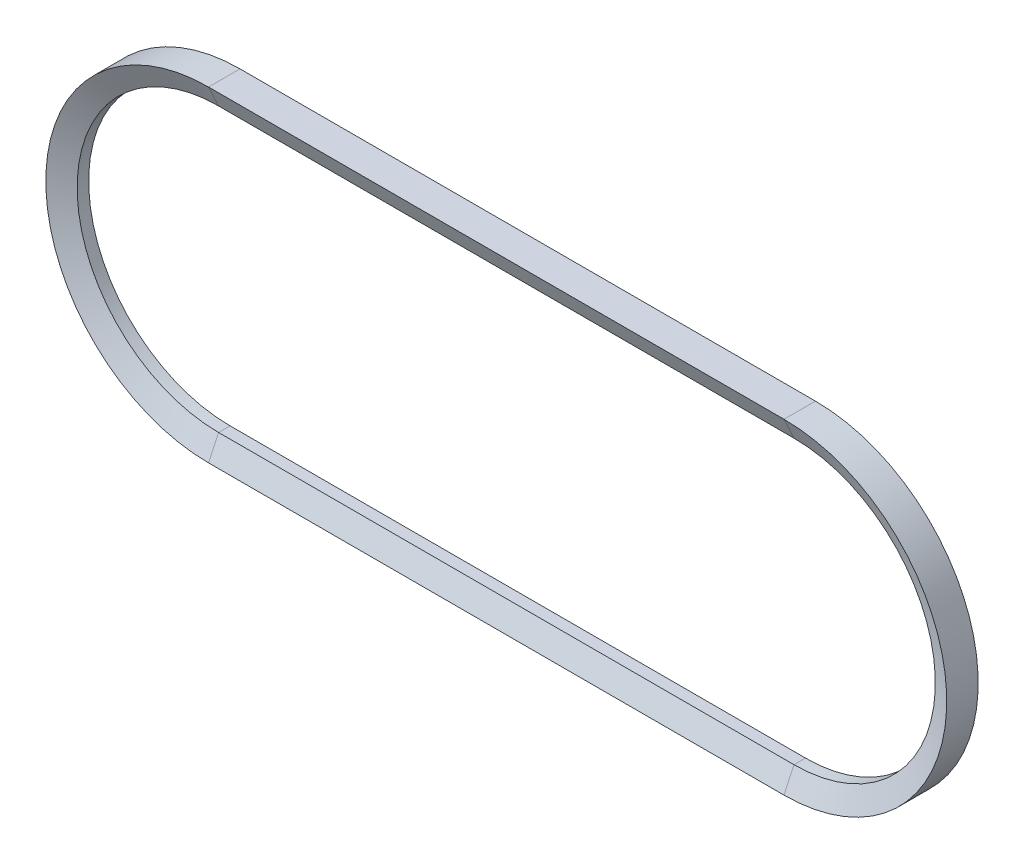
ISO-10303-21;
HEADER;
FILE_DESCRIPTION(('STEP AP214'),'2;1');
FILE_NAME('part.step','',(''),(''),'','','');
FILE_SCHEMA(('AUTOMOTIVE_DESIGN { 1 0 10303 214 1 1 1 1 }'));
ENDSEC;
DATA;
#1=APPLICATION_CONTEXT('core data for automotive mechanical design processes');
#2=APPLICATION_PROTOCOL_DEFINITION('international standard','automotive_design',2000,#1);
#3=PRODUCT_CONTEXT('',#1,'mechanical');
#4=PRODUCT('Part','Part','',(#3));
#5=PRODUCT_RELATED_PRODUCT_CATEGORY('part','',(#4));
#6=PRODUCT_DEFINITION_FORMATION('','',#4);
#7=PRODUCT_DEFINITION_CONTEXT('part definition',#1,'design');
#8=PRODUCT_DEFINITION('design','',#6,#7);
#9=PRODUCT_DEFINITION_SHAPE('','',#8);
#10=(LENGTH_UNIT() NAMED_UNIT(*) SI_UNIT(.MILLI.,.METRE.));
#11=(NAMED_UNIT(*) PLANE_ANGLE_UNIT() SI_UNIT($,.RADIAN.));
#12=(NAMED_UNIT(*) SI_UNIT($,.STERADIAN.) SOLID_ANGLE_UNIT());
#13=UNCERTAINTY_MEASURE_WITH_UNIT(LENGTH_MEASURE(1.E-05),#10,'distance_accuracy_value','');
#14=(GEOMETRIC_REPRESENTATION_CONTEXT(3) GLOBAL_UNCERTAINTY_ASSIGNED_CONTEXT((#13)) GLOBAL_UNIT_ASSIGNED_CONTEXT((#10,
#11,#12)) REPRESENTATION_CONTEXT('',''));
#15=CARTESIAN_POINT('',(0.,0.,0.));
#16=DIRECTION('',(0.,0.,1.));
#17=DIRECTION('',(1.,0.,0.));
#18=AXIS2_PLACEMENT_3D('',#15,#16,#17);
#19=CARTESIAN_POINT('',(700.000000000001,172.000000000001,-7.00000000000001));
#20=DIRECTION('',(0.,0.4226182617407,0.90630778703665));
#21=DIRECTION('',(0.,-0.90630778703665,0.4226182617407));
#22=AXIS2_PLACEMENT_3D('',#19,#20,#21);
#23=PLANE('',#22);
#24=DIRECTION('',(0.,0.90630778703665,-0.4226182617407));
#25=VECTOR('',#24,1.);
#26=CARTESIAN_POINT('',(700.000000000001,172.000000000001,-7.00000000000001));
#27=LINE('',#26,#25);
#28=CARTESIAN_POINT('',(700.000000000001,172.000000000001,-7.00000000000001));
#29=VERTEX_POINT('',#28);
#30=CARTESIAN_POINT('',(700.000000000001,198.000000000001,-19.12399911203));
#31=VERTEX_POINT('',#30);
#32=EDGE_CURVE('E153',#29,#31,#27,.T.);
#33=ORIENTED_EDGE('',*,*,#32,.F.);
#34=DIRECTION('',(-1.,0.,0.));
#35=VECTOR('',#34,1.);
#36=CARTESIAN_POINT('',(700.000000000001,172.000000000001,-7.00000000000001));
#37=LINE('',#36,#35);
#38=CARTESIAN_POINT('',(0.,172.,-7.00000000000001));
#39=VERTEX_POINT('',#38);
#40=EDGE_CURVE('E152',#29,#39,#37,.T.);
#41=ORIENTED_EDGE('',*,*,#40,.T.);
#42=DIRECTION('',(0.,0.90630778703665,-0.4226182617407));
#43=VECTOR('',#42,1.);
#44=CARTESIAN_POINT('',(0.,172.,-7.00000000000001));
#45=LINE('',#44,#43);
#46=CARTESIAN_POINT('',(0.,198.,-19.12399911203));
#47=VERTEX_POINT('',#46);
#48=EDGE_CURVE('E131',#39,#47,#45,.T.);
#49=ORIENTED_EDGE('',*,*,#48,.T.);
#50=DIRECTION('',(-1.,0.,0.));
#51=VECTOR('',#50,1.);
#52=CARTESIAN_POINT('',(700.000000000001,198.000000000001,-19.12399911203));
#53=LINE('',#52,#51);
#54=EDGE_CURVE('E157',#31,#47,#53,.T.);
#55=ORIENTED_EDGE('',*,*,#54,.F.);
#56=EDGE_LOOP('',(#33,#41,#49,#55));
#57=FACE_BOUND('',#56,.T.);
#58=ADVANCED_FACE('F37',(#57),#23,.F.);
#59=CARTESIAN_POINT('',(1.09447445373907E-13,0.,-7.00000000000001));
#60=DIRECTION('',(0.,0.,-1.));
#61=DIRECTION('',(-1.,0.,0.));
#62=AXIS2_PLACEMENT_3D('',#59,#60,#61);
#63=CONICAL_SURFACE('',#62,172.,1.13446401379631);
#64=CARTESIAN_POINT('',(1.09447445373907E-13,0.,-19.12399911203));
#65=DIRECTION('',(0.,0.,1.));
#66=DIRECTION('',(0.,1.,0.));
#67=AXIS2_PLACEMENT_3D('',#64,#65,#66);
#68=CIRCLE('',#67,198.);
#69=CARTESIAN_POINT('',(0.,-198.,-19.12399911203));
#70=VERTEX_POINT('',#69);
#71=EDGE_CURVE('E121',#47,#70,#68,.T.);
#72=ORIENTED_EDGE('',*,*,#71,.F.);
#73=ORIENTED_EDGE('',*,*,#48,.F.);
#74=CARTESIAN_POINT('',(1.09447445373907E-13,0.,-7.00000000000001));
#75=DIRECTION('',(0.,0.,1.));
#76=DIRECTION('',(0.,1.,0.));
#77=AXIS2_PLACEMENT_3D('',#74,#75,#76);
#78=CIRCLE('',#77,172.);
#79=CARTESIAN_POINT('',(0.,-172.,-7.00000000000001));
#80=VERTEX_POINT('',#79);
#81=EDGE_CURVE('E134',#39,#80,#78,.T.);
#82=ORIENTED_EDGE('',*,*,#81,.T.);
#83=DIRECTION('',(0.,-0.90630778703665,-0.4226182617407));
#84=VECTOR('',#83,1.);
#85=CARTESIAN_POINT('',(0.,-172.,-7.00000000000001));
#86=LINE('',#85,#84);
#87=EDGE_CURVE('E149',#80,#70,#86,.T.);
#88=ORIENTED_EDGE('',*,*,#87,.T.);
#89=EDGE_LOOP('',(#72,#73,#82,#88));
#90=FACE_BOUND('',#89,.T.);
#91=ADVANCED_FACE('F133',(#90),#63,.F.);
#92=CARTESIAN_POINT('',(1.09447445373907E-13,0.,0.));
#93=DIRECTION('',(0.,0.,1.));
#94=DIRECTION('',(1.,0.,0.));
#95=AXIS2_PLACEMENT_3D('',#92,#93,#94);
#96=CYLINDRICAL_SURFACE('',#95,198.);
#97=CARTESIAN_POINT('',(1.09447445373907E-13,0.,19.12399911203));
#98=DIRECTION('',(0.,0.,1.));
#99=DIRECTION('',(0.,1.,0.));
#100=AXIS2_PLACEMENT_3D('',#97,#98,#99);
#101=CIRCLE('',#100,198.);
#102=CARTESIAN_POINT('',(0.,198.,19.12399911203));
#103=VERTEX_POINT('',#102);
#104=CARTESIAN_POINT('',(0.,-198.,19.12399911203));
#105=VERTEX_POINT('',#104);
#106=EDGE_CURVE('E115',#103,#105,#101,.T.);
#107=ORIENTED_EDGE('',*,*,#106,.F.);
#108=DIRECTION('',(0.,0.,1.));
#109=VECTOR('',#108,1.);
#110=CARTESIAN_POINT('',(0.,198.,19.12399911203));
#111=LINE('',#110,#109);
#112=EDGE_CURVE('E139',#47,#103,#111,.T.);
#113=ORIENTED_EDGE('',*,*,#112,.F.);
#114=ORIENTED_EDGE('',*,*,#71,.T.);
#115=DIRECTION('',(0.,0.,1.));
#116=VECTOR('',#115,1.);
#117=CARTESIAN_POINT('',(0.,-198.,19.12399911203));
#118=LINE('',#117,#116);
#119=EDGE_CURVE('E197',#70,#105,#118,.T.);
#120=ORIENTED_EDGE('',*,*,#119,.T.);
#121=EDGE_LOOP('',(#107,#113,#114,#120));
#122=FACE_BOUND('',#121,.T.);
#123=ADVANCED_FACE('F216',(#122),#96,.T.);
#124=CARTESIAN_POINT('',(1.09447445373907E-13,0.,19.12399911203));
#125=DIRECTION('',(0.,0.,1.));
#126=DIRECTION('',(1.,0.,0.));
#127=AXIS2_PLACEMENT_3D('',#124,#125,#126);
#128=CONICAL_SURFACE('',#127,198.,1.13446401379631);
#129=CARTESIAN_POINT('',(1.09447445373907E-13,0.,7.00000000000001));
#130=DIRECTION('',(0.,0.,1.));
#131=DIRECTION('',(0.,1.,0.));
#132=AXIS2_PLACEMENT_3D('',#129,#130,#131);
#133=CIRCLE('',#132,172.);
#134=CARTESIAN_POINT('',(0.,172.,7.00000000000001));
#135=VERTEX_POINT('',#134);
#136=CARTESIAN_POINT('',(0.,-172.,7.00000000000001));
#137=VERTEX_POINT('',#136);
#138=EDGE_CURVE('E167',#135,#137,#133,.T.);
#139=ORIENTED_EDGE('',*,*,#138,.F.);
#140=DIRECTION('',(0.,-0.90630778703665,-0.4226182617407));
#141=VECTOR('',#140,1.);
#142=CARTESIAN_POINT('',(0.,172.,7.00000000000001));
#143=LINE('',#142,#141);
#144=EDGE_CURVE('E160',#103,#135,#143,.T.);
#145=ORIENTED_EDGE('',*,*,#144,.F.);
#146=ORIENTED_EDGE('',*,*,#106,.T.);
#147=DIRECTION('',(0.,0.90630778703665,-0.4226182617407));
#148=VECTOR('',#147,1.);
#149=CARTESIAN_POINT('',(0.,-172.,7.00000000000001));
#150=LINE('',#149,#148);
#151=EDGE_CURVE('E185',#105,#137,#150,.T.);
#152=ORIENTED_EDGE('',*,*,#151,.T.);
#153=EDGE_LOOP('',(#139,#145,#146,#152));
#154=FACE_BOUND('',#153,.T.);
#155=ADVANCED_FACE('F184',(#154),#128,.F.);
#156=CARTESIAN_POINT('',(1.09447445373907E-13,0.,0.));
#157=DIRECTION('',(0.,0.,1.));
#158=DIRECTION('',(1.,0.,0.));
#159=AXIS2_PLACEMENT_3D('',#156,#157,#158);
#160=CYLINDRICAL_SURFACE('',#159,172.);
#161=DIRECTION('',(0.,0.,-1.));
#162=VECTOR('',#161,1.);
#163=CARTESIAN_POINT('',(0.,-172.,7.00000000000001));
#164=LINE('',#163,#162);
#165=EDGE_CURVE('E147',#137,#80,#164,.T.);
#166=ORIENTED_EDGE('',*,*,#165,.T.);
#167=ORIENTED_EDGE('',*,*,#81,.F.);
#168=DIRECTION('',(0.,0.,-1.));
#169=VECTOR('',#168,1.);
#170=CARTESIAN_POINT('',(0.,172.,7.00000000000001));
#171=LINE('',#170,#169);
#172=EDGE_CURVE('E146',#135,#39,#171,.T.);
#173=ORIENTED_EDGE('',*,*,#172,.F.);
#174=ORIENTED_EDGE('',*,*,#138,.T.);
#175=EDGE_LOOP('',(#166,#167,#173,#174));
#176=FACE_BOUND('',#175,.T.);
#177=ADVANCED_FACE('F144',(#176),#160,.F.);
#178=CARTESIAN_POINT('',(0.,-172.,-7.00000000000001));
#179=DIRECTION('',(0.,-0.4226182617407,0.90630778703665));
#180=DIRECTION('',(0.,-0.90630778703665,-0.4226182617407));
#181=AXIS2_PLACEMENT_3D('',#178,#179,#180);
#182=PLANE('',#181);
#183=DIRECTION('',(1.,0.,0.));
#184=VECTOR('',#183,1.);
#185=CARTESIAN_POINT('',(0.,-198.,-19.12399911203));
#186=LINE('',#185,#184);
#187=CARTESIAN_POINT('',(700.000000000002,-197.999999999999,-19.12399911203));
#188=VERTEX_POINT('',#187);
#189=EDGE_CURVE('E102',#70,#188,#186,.T.);
#190=ORIENTED_EDGE('',*,*,#189,.F.);
#191=ORIENTED_EDGE('',*,*,#87,.F.);
#192=DIRECTION('',(1.,0.,0.));
#193=VECTOR('',#192,1.);
#194=CARTESIAN_POINT('',(0.,-172.,-7.00000000000001));
#195=LINE('',#194,#193);
#196=CARTESIAN_POINT('',(700.000000000002,-171.999999999999,-7.00000000000001));
#197=VERTEX_POINT('',#196);
#198=EDGE_CURVE('E166',#80,#197,#195,.T.);
#199=ORIENTED_EDGE('',*,*,#198,.T.);
#200=DIRECTION('',(0.,-0.90630778703665,-0.4226182617407));
#201=VECTOR('',#200,1.);
#202=CARTESIAN_POINT('',(700.000000000002,-171.999999999999,-7.00000000000001));
#203=LINE('',#202,#201);
#204=EDGE_CURVE('E207',#197,#188,#203,.T.);
#205=ORIENTED_EDGE('',*,*,#204,.T.);
#206=EDGE_LOOP('',(#190,#191,#199,#205));
#207=FACE_BOUND('',#206,.T.);
#208=ADVANCED_FACE('F212',(#207),#182,.F.);
#209=CARTESIAN_POINT('',(0.,-198.,19.12399911203));
#210=DIRECTION('',(0.,1.,0.));
#211=DIRECTION('',(-1.,0.,0.));
#212=AXIS2_PLACEMENT_3D('',#209,#210,#211);
#213=PLANE('',#212);
#214=DIRECTION('',(1.,0.,0.));
#215=VECTOR('',#214,1.);
#216=CARTESIAN_POINT('',(0.,-198.,19.12399911203));
#217=LINE('',#216,#215);
#218=CARTESIAN_POINT('',(700.000000000002,-197.999999999999,19.12399911203));
#219=VERTEX_POINT('',#218);
#220=EDGE_CURVE('E95',#105,#219,#217,.T.);
#221=ORIENTED_EDGE('',*,*,#220,.F.);
#222=ORIENTED_EDGE('',*,*,#119,.F.);
#223=ORIENTED_EDGE('',*,*,#189,.T.);
#224=DIRECTION('',(0.,0.,1.));
#225=VECTOR('',#224,1.);
#226=CARTESIAN_POINT('',(700.000000000002,-197.999999999999,19.12399911203));
#227=LINE('',#226,#225);
#228=EDGE_CURVE('E194',#188,#219,#227,.T.);
#229=ORIENTED_EDGE('',*,*,#228,.T.);
#230=EDGE_LOOP('',(#221,#222,#223,#229));
#231=FACE_BOUND('',#230,.T.);
#232=ADVANCED_FACE('F215',(#231),#213,.F.);
#233=CARTESIAN_POINT('',(0.,-172.,7.00000000000001));
#234=DIRECTION('',(0.,-0.4226182617407,-0.90630778703665));
#235=DIRECTION('',(0.,0.90630778703665,-0.4226182617407));
#236=AXIS2_PLACEMENT_3D('',#233,#234,#235);
#237=PLANE('',#236);
#238=DIRECTION('',(1.,0.,0.));
#239=VECTOR('',#238,1.);
#240=CARTESIAN_POINT('',(0.,-172.,7.00000000000001));
#241=LINE('',#240,#239);
#242=CARTESIAN_POINT('',(700.000000000002,-171.999999999999,7.00000000000001));
#243=VERTEX_POINT('',#242);
#244=EDGE_CURVE('E86',#137,#243,#241,.T.);
#245=ORIENTED_EDGE('',*,*,#244,.F.);
#246=ORIENTED_EDGE('',*,*,#151,.F.);
#247=ORIENTED_EDGE('',*,*,#220,.T.);
#248=DIRECTION('',(0.,0.90630778703665,-0.4226182617407));
#249=VECTOR('',#248,1.);
#250=CARTESIAN_POINT('',(700.000000000002,-171.999999999999,7.00000000000001));
#251=LINE('',#250,#249);
#252=EDGE_CURVE('E172',#219,#243,#251,.T.);
#253=ORIENTED_EDGE('',*,*,#252,.T.);
#254=EDGE_LOOP('',(#245,#246,#247,#253));
#255=FACE_BOUND('',#254,.T.);
#256=ADVANCED_FACE('F234',(#255),#237,.F.);
#257=CARTESIAN_POINT('',(0.,-172.,7.00000000000001));
#258=DIRECTION('',(0.,-1.,0.));
#259=DIRECTION('',(1.,0.,0.));
#260=AXIS2_PLACEMENT_3D('',#257,#258,#259);
#261=PLANE('',#260);
#262=DIRECTION('',(0.,0.,-1.));
#263=VECTOR('',#262,1.);
#264=CARTESIAN_POINT('',(700.000000000002,-171.999999999999,7.00000000000001));
#265=LINE('',#264,#263);
#266=EDGE_CURVE('E168',#243,#197,#265,.T.);
#267=ORIENTED_EDGE('',*,*,#266,.T.);
#268=ORIENTED_EDGE('',*,*,#198,.F.);
#269=ORIENTED_EDGE('',*,*,#165,.F.);
#270=ORIENTED_EDGE('',*,*,#244,.T.);
#271=EDGE_LOOP('',(#267,#268,#269,#270));
#272=FACE_BOUND('',#271,.T.);
#273=ADVANCED_FACE('F226',(#272),#261,.F.);
#274=CARTESIAN_POINT('',(700.000000000002,1.19781344355109E-12,-7.00000000000001));
#275=DIRECTION('',(0.,0.,-1.));
#276=DIRECTION('',(-1.,0.,0.));
#277=AXIS2_PLACEMENT_3D('',#274,#275,#276);
#278=CONICAL_SURFACE('',#277,172.,1.13446401379631);
#279=CARTESIAN_POINT('',(700.000000000002,1.19781344355109E-12,-19.12399911203));
#280=DIRECTION('',(0.,0.,1.));
#281=DIRECTION('',(0.,-1.,0.));
#282=AXIS2_PLACEMENT_3D('',#279,#280,#281);
#283=CIRCLE('',#282,198.);
#284=EDGE_CURVE('E192',#188,#31,#283,.T.);
#285=ORIENTED_EDGE('',*,*,#284,.F.);
#286=ORIENTED_EDGE('',*,*,#204,.F.);
#287=CARTESIAN_POINT('',(700.000000000002,1.19781344355109E-12,-7.00000000000001));
#288=DIRECTION('',(0.,0.,1.));
#289=DIRECTION('',(0.,-1.,0.));
#290=AXIS2_PLACEMENT_3D('',#287,#288,#289);
#291=CIRCLE('',#290,172.);
#292=EDGE_CURVE('E169',#197,#29,#291,.T.);
#293=ORIENTED_EDGE('',*,*,#292,.T.);
#294=ORIENTED_EDGE('',*,*,#32,.T.);
#295=EDGE_LOOP('',(#285,#286,#293,#294));
#296=FACE_BOUND('',#295,.T.);
#297=ADVANCED_FACE('F224',(#296),#278,.F.);
#298=CARTESIAN_POINT('',(700.000000000002,1.19781344355109E-12,0.));
#299=DIRECTION('',(0.,0.,1.));
#300=DIRECTION('',(1.,0.,0.));
#301=AXIS2_PLACEMENT_3D('',#298,#299,#300);
#302=CYLINDRICAL_SURFACE('',#301,198.);
#303=CARTESIAN_POINT('',(700.000000000002,1.19781344355109E-12,19.12399911203));
#304=DIRECTION('',(0.,0.,1.));
#305=DIRECTION('',(0.,-1.,0.));
#306=AXIS2_PLACEMENT_3D('',#303,#304,#305);
#307=CIRCLE('',#306,198.);
#308=CARTESIAN_POINT('',(700.000000000001,198.000000000001,19.12399911203));
#309=VERTEX_POINT('',#308);
#310=EDGE_CURVE('E62',#219,#309,#307,.T.);
#311=ORIENTED_EDGE('',*,*,#310,.F.);
#312=ORIENTED_EDGE('',*,*,#228,.F.);
#313=ORIENTED_EDGE('',*,*,#284,.T.);
#314=DIRECTION('',(0.,0.,1.));
#315=VECTOR('',#314,1.);
#316=CARTESIAN_POINT('',(700.000000000001,198.000000000001,19.12399911203));
#317=LINE('',#316,#315);
#318=EDGE_CURVE('E190',#31,#309,#317,.T.);
#319=ORIENTED_EDGE('',*,*,#318,.T.);
#320=EDGE_LOOP('',(#311,#312,#313,#319));
#321=FACE_BOUND('',#320,.T.);
#322=ADVANCED_FACE('F221',(#321),#302,.T.);
#323=CARTESIAN_POINT('',(700.000000000002,1.19781344355109E-12,19.12399911203));
#324=DIRECTION('',(0.,0.,1.));
#325=DIRECTION('',(1.,0.,0.));
#326=AXIS2_PLACEMENT_3D('',#323,#324,#325);
#327=CONICAL_SURFACE('',#326,198.,1.13446401379631);
#328=CARTESIAN_POINT('',(700.000000000002,1.19781344355109E-12,7.00000000000001));
#329=DIRECTION('',(0.,0.,1.));
#330=DIRECTION('',(0.,-1.,0.));
#331=AXIS2_PLACEMENT_3D('',#328,#329,#330);
#332=CIRCLE('',#331,172.);
#333=CARTESIAN_POINT('',(700.000000000001,172.000000000001,7.00000000000001));
#334=VERTEX_POINT('',#333);
#335=EDGE_CURVE('E54',#243,#334,#332,.T.);
#336=ORIENTED_EDGE('',*,*,#335,.F.);
#337=ORIENTED_EDGE('',*,*,#252,.F.);
#338=ORIENTED_EDGE('',*,*,#310,.T.);
#339=DIRECTION('',(0.,-0.90630778703665,-0.4226182617407));
#340=VECTOR('',#339,1.);
#341=CARTESIAN_POINT('',(700.000000000001,172.000000000001,7.00000000000001));
#342=LINE('',#341,#340);
#343=EDGE_CURVE('E177',#309,#334,#342,.T.);
#344=ORIENTED_EDGE('',*,*,#343,.T.);
#345=EDGE_LOOP('',(#336,#337,#338,#344));
#346=FACE_BOUND('',#345,.T.);
#347=ADVANCED_FACE('F232',(#346),#327,.F.);
#348=CARTESIAN_POINT('',(700.000000000002,1.19781344355109E-12,0.));
#349=DIRECTION('',(0.,0.,1.));
#350=DIRECTION('',(1.,0.,0.));
#351=AXIS2_PLACEMENT_3D('',#348,#349,#350);
#352=CYLINDRICAL_SURFACE('',#351,172.);
#353=DIRECTION('',(0.,0.,-1.));
#354=VECTOR('',#353,1.);
#355=CARTESIAN_POINT('',(700.000000000001,172.000000000001,7.00000000000001));
#356=LINE('',#355,#354);
#357=EDGE_CURVE('E41',#334,#29,#356,.T.);
#358=ORIENTED_EDGE('',*,*,#357,.T.);
#359=ORIENTED_EDGE('',*,*,#292,.F.);
#360=ORIENTED_EDGE('',*,*,#266,.F.);
#361=ORIENTED_EDGE('',*,*,#335,.T.);
#362=EDGE_LOOP('',(#358,#359,#360,#361));
#363=FACE_BOUND('',#362,.T.);
#364=ADVANCED_FACE('F178',(#363),#352,.F.);
#365=CARTESIAN_POINT('',(700.000000000001,198.000000000001,19.12399911203));
#366=DIRECTION('',(0.,-1.,0.));
#367=DIRECTION('',(1.,0.,0.));
#368=AXIS2_PLACEMENT_3D('',#365,#366,#367);
#369=PLANE('',#368);
#370=ORIENTED_EDGE('',*,*,#54,.T.);
#371=ORIENTED_EDGE('',*,*,#112,.T.);
#372=DIRECTION('',(-1.,0.,0.));
#373=VECTOR('',#372,1.);
#374=CARTESIAN_POINT('',(700.000000000001,198.000000000001,19.12399911203));
#375=LINE('',#374,#373);
#376=EDGE_CURVE('E46',#309,#103,#375,.T.);
#377=ORIENTED_EDGE('',*,*,#376,.F.);
#378=ORIENTED_EDGE('',*,*,#318,.F.);
#379=EDGE_LOOP('',(#370,#371,#377,#378));
#380=FACE_BOUND('',#379,.T.);
#381=ADVANCED_FACE('F218',(#380),#369,.F.);
#382=CARTESIAN_POINT('',(700.000000000001,172.000000000001,7.00000000000001));
#383=DIRECTION('',(0.,0.4226182617407,-0.90630778703665));
#384=DIRECTION('',(0.,0.90630778703665,0.4226182617407));
#385=AXIS2_PLACEMENT_3D('',#382,#383,#384);
#386=PLANE('',#385);
#387=ORIENTED_EDGE('',*,*,#376,.T.);
#388=ORIENTED_EDGE('',*,*,#144,.T.);
#389=DIRECTION('',(-1.,0.,0.));
#390=VECTOR('',#389,1.);
#391=CARTESIAN_POINT('',(700.000000000001,172.000000000001,7.00000000000001));
#392=LINE('',#391,#390);
#393=EDGE_CURVE('E11',#334,#135,#392,.T.);
#394=ORIENTED_EDGE('',*,*,#393,.F.);
#395=ORIENTED_EDGE('',*,*,#343,.F.);
#396=EDGE_LOOP('',(#387,#388,#394,#395));
#397=FACE_BOUND('',#396,.T.);
#398=ADVANCED_FACE('F182',(#397),#386,.F.);
#399=CARTESIAN_POINT('',(700.000000000001,172.000000000001,7.00000000000001));
#400=DIRECTION('',(0.,1.,0.));
#401=DIRECTION('',(-1.,0.,0.));
#402=AXIS2_PLACEMENT_3D('',#399,#400,#401);
#403=PLANE('',#402);
#404=ORIENTED_EDGE('',*,*,#393,.T.);
#405=ORIENTED_EDGE('',*,*,#172,.T.);
#406=ORIENTED_EDGE('',*,*,#40,.F.);
#407=ORIENTED_EDGE('',*,*,#357,.F.);
#408=EDGE_LOOP('',(#404,#405,#406,#407));
#409=FACE_BOUND('',#408,.T.);
#410=ADVANCED_FACE('F39',(#409),#403,.F.);
#411=CLOSED_SHELL('',(#58,#91,#123,#155,#177,#208,#232,#256,#273,#297,#322,#347,#364,#381,#398,#410));
#412=MANIFOLD_SOLID_BREP('B2',#411);
#413=ADVANCED_BREP_SHAPE_REPRESENTATION('',(#18,#412),#14);
#414=SHAPE_DEFINITION_REPRESENTATION(#9,#413);
ENDSEC;
END-ISO-10303-21;
